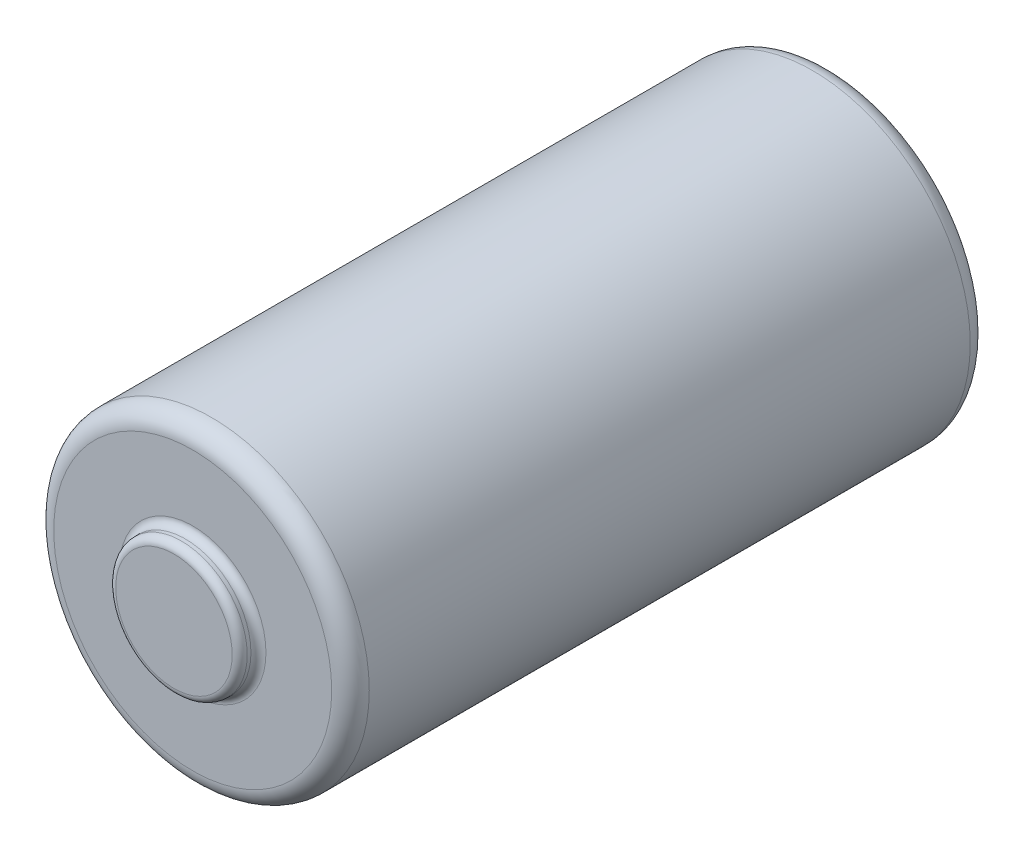
ISO-10303-21;
HEADER;
FILE_DESCRIPTION(('STEP AP214'),'2;1');
FILE_NAME('part.step','',(''),(''),'','','');
FILE_SCHEMA(('AUTOMOTIVE_DESIGN { 1 0 10303 214 1 1 1 1 }'));
ENDSEC;
DATA;
#1=APPLICATION_CONTEXT('core data for automotive mechanical design processes');
#2=APPLICATION_PROTOCOL_DEFINITION('international standard','automotive_design',2000,#1);
#3=PRODUCT_CONTEXT('',#1,'mechanical');
#4=PRODUCT('Part','Part','',(#3));
#5=PRODUCT_RELATED_PRODUCT_CATEGORY('part','',(#4));
#6=PRODUCT_DEFINITION_FORMATION('','',#4);
#7=PRODUCT_DEFINITION_CONTEXT('part definition',#1,'design');
#8=PRODUCT_DEFINITION('design','',#6,#7);
#9=PRODUCT_DEFINITION_SHAPE('','',#8);
#10=(LENGTH_UNIT() NAMED_UNIT(*) SI_UNIT(.MILLI.,.METRE.));
#11=(NAMED_UNIT(*) PLANE_ANGLE_UNIT() SI_UNIT($,.RADIAN.));
#12=(NAMED_UNIT(*) SI_UNIT($,.STERADIAN.) SOLID_ANGLE_UNIT());
#13=UNCERTAINTY_MEASURE_WITH_UNIT(LENGTH_MEASURE(1.E-05),#10,'distance_accuracy_value','');
#14=(GEOMETRIC_REPRESENTATION_CONTEXT(3) GLOBAL_UNCERTAINTY_ASSIGNED_CONTEXT((#13)) GLOBAL_UNIT_ASSIGNED_CONTEXT((#10,
#11,#12)) REPRESENTATION_CONTEXT('',''));
#15=CARTESIAN_POINT('',(0.,0.,0.));
#16=DIRECTION('',(0.,0.,1.));
#17=DIRECTION('',(1.,0.,0.));
#18=AXIS2_PLACEMENT_3D('',#15,#16,#17);
#19=CARTESIAN_POINT('',(0.,0.,34.));
#20=DIRECTION('',(0.,0.,1.));
#21=DIRECTION('',(1.,0.,0.));
#22=AXIS2_PLACEMENT_3D('',#19,#20,#21);
#23=PLANE('',#22);
#24=CARTESIAN_POINT('',(0.,0.,34.));
#25=DIRECTION('',(0.,0.,1.));
#26=DIRECTION('',(1.,0.,0.));
#27=AXIS2_PLACEMENT_3D('',#24,#25,#26);
#28=CIRCLE('',#27,3.9);
#29=CARTESIAN_POINT('',(3.9,0.,34.));
#30=VERTEX_POINT('',#29);
#31=EDGE_CURVE('E10',#30,#30,#28,.F.);
#32=ORIENTED_EDGE('',*,*,#31,.T.);
#33=EDGE_LOOP('',(#32));
#34=FACE_BOUND('',#33,.T.);
#35=CARTESIAN_POINT('',(0.,0.,34.));
#36=DIRECTION('',(0.,0.,1.));
#37=DIRECTION('',(1.,0.,0.));
#38=AXIS2_PLACEMENT_3D('',#35,#36,#37);
#39=CIRCLE('',#38,7.4);
#40=CARTESIAN_POINT('',(7.4,0.,34.));
#41=VERTEX_POINT('',#40);
#42=EDGE_CURVE('E53',#41,#41,#39,.T.);
#43=ORIENTED_EDGE('',*,*,#42,.T.);
#44=EDGE_LOOP('',(#43));
#45=FACE_BOUND('',#44,.T.);
#46=ADVANCED_FACE('F33',(#34,#45),#23,.T.);
#47=CARTESIAN_POINT('',(0.,0.,34.));
#48=DIRECTION('',(0.,0.,-1.));
#49=DIRECTION('',(-1.,0.,0.));
#50=AXIS2_PLACEMENT_3D('',#47,#48,#49);
#51=CYLINDRICAL_SURFACE('',#50,8.4);
#52=CARTESIAN_POINT('',(0.,0.,1.));
#53=DIRECTION('',(0.,0.,1.));
#54=DIRECTION('',(1.,0.,0.));
#55=AXIS2_PLACEMENT_3D('',#52,#53,#54);
#56=CIRCLE('',#55,8.4);
#57=CARTESIAN_POINT('',(8.4,0.,1.));
#58=VERTEX_POINT('',#57);
#59=EDGE_CURVE('E59',#58,#58,#56,.T.);
#60=ORIENTED_EDGE('',*,*,#59,.T.);
#61=EDGE_LOOP('',(#60));
#62=FACE_BOUND('',#61,.T.);
#63=CARTESIAN_POINT('',(0.,0.,33.));
#64=DIRECTION('',(0.,0.,1.));
#65=DIRECTION('',(1.,0.,0.));
#66=AXIS2_PLACEMENT_3D('',#63,#64,#65);
#67=CIRCLE('',#66,8.4);
#68=CARTESIAN_POINT('',(8.4,0.,33.));
#69=VERTEX_POINT('',#68);
#70=EDGE_CURVE('E62',#69,#69,#67,.F.);
#71=ORIENTED_EDGE('',*,*,#70,.T.);
#72=EDGE_LOOP('',(#71));
#73=FACE_BOUND('',#72,.T.);
#74=ADVANCED_FACE('F66',(#62,#73),#51,.T.);
#75=CARTESIAN_POINT('',(0.,0.,0.));
#76=DIRECTION('',(0.,0.,1.));
#77=DIRECTION('',(1.,0.,0.));
#78=AXIS2_PLACEMENT_3D('',#75,#76,#77);
#79=PLANE('',#78);
#80=CARTESIAN_POINT('',(0.,0.,0.));
#81=DIRECTION('',(0.,0.,1.));
#82=DIRECTION('',(1.,0.,0.));
#83=AXIS2_PLACEMENT_3D('',#80,#81,#82);
#84=CIRCLE('',#83,7.4);
#85=CARTESIAN_POINT('',(7.4,0.,0.));
#86=VERTEX_POINT('',#85);
#87=EDGE_CURVE('E56',#86,#86,#84,.F.);
#88=ORIENTED_EDGE('',*,*,#87,.T.);
#89=EDGE_LOOP('',(#88));
#90=FACE_BOUND('',#89,.T.);
#91=ADVANCED_FACE('F81',(#90),#79,.F.);
#92=CARTESIAN_POINT('',(0.,0.,35.));
#93=DIRECTION('',(0.,0.,-1.));
#94=DIRECTION('',(-1.,0.,0.));
#95=AXIS2_PLACEMENT_3D('',#92,#93,#94);
#96=CYLINDRICAL_SURFACE('',#95,3.5);
#97=CARTESIAN_POINT('',(0.,0.,34.6));
#98=DIRECTION('',(0.,0.,1.));
#99=DIRECTION('',(1.,0.,0.));
#100=AXIS2_PLACEMENT_3D('',#97,#98,#99);
#101=CIRCLE('',#100,3.5);
#102=CARTESIAN_POINT('',(3.5,0.,34.6));
#103=VERTEX_POINT('',#102);
#104=EDGE_CURVE('E40',#103,#103,#101,.F.);
#105=ORIENTED_EDGE('',*,*,#104,.T.);
#106=EDGE_LOOP('',(#105));
#107=FACE_BOUND('',#106,.T.);
#108=CARTESIAN_POINT('',(0.,0.,34.4));
#109=DIRECTION('',(0.,0.,1.));
#110=DIRECTION('',(1.,0.,0.));
#111=AXIS2_PLACEMENT_3D('',#108,#109,#110);
#112=CIRCLE('',#111,3.5);
#113=CARTESIAN_POINT('',(3.5,0.,34.4));
#114=VERTEX_POINT('',#113);
#115=EDGE_CURVE('E44',#114,#114,#112,.T.);
#116=ORIENTED_EDGE('',*,*,#115,.T.);
#117=EDGE_LOOP('',(#116));
#118=FACE_BOUND('',#117,.T.);
#119=ADVANCED_FACE('F86',(#107,#118),#96,.T.);
#120=CARTESIAN_POINT('',(0.,0.,35.));
#121=DIRECTION('',(0.,0.,1.));
#122=DIRECTION('',(1.,0.,0.));
#123=AXIS2_PLACEMENT_3D('',#120,#121,#122);
#124=PLANE('',#123);
#125=CARTESIAN_POINT('',(0.,0.,35.));
#126=DIRECTION('',(0.,0.,1.));
#127=DIRECTION('',(1.,0.,0.));
#128=AXIS2_PLACEMENT_3D('',#125,#126,#127);
#129=CIRCLE('',#128,3.1);
#130=CARTESIAN_POINT('',(3.1,0.,35.));
#131=VERTEX_POINT('',#130);
#132=EDGE_CURVE('E48',#131,#131,#129,.T.);
#133=ORIENTED_EDGE('',*,*,#132,.T.);
#134=EDGE_LOOP('',(#133));
#135=FACE_BOUND('',#134,.T.);
#136=ADVANCED_FACE('F92',(#135),#124,.T.);
#137=CARTESIAN_POINT('',(0.,0.,1.));
#138=DIRECTION('',(0.,0.,1.));
#139=DIRECTION('',(1.,0.,0.));
#140=AXIS2_PLACEMENT_3D('',#137,#138,#139);
#141=TOROIDAL_SURFACE('',#140,7.4,1.);
#142=ORIENTED_EDGE('',*,*,#87,.F.);
#143=EDGE_LOOP('',(#142));
#144=FACE_BOUND('',#143,.T.);
#145=ORIENTED_EDGE('',*,*,#59,.F.);
#146=EDGE_LOOP('',(#145));
#147=FACE_BOUND('',#146,.T.);
#148=ADVANCED_FACE('F72',(#144,#147),#141,.T.);
#149=CARTESIAN_POINT('',(0.,0.,33.));
#150=DIRECTION('',(0.,0.,1.));
#151=DIRECTION('',(1.,0.,0.));
#152=AXIS2_PLACEMENT_3D('',#149,#150,#151);
#153=TOROIDAL_SURFACE('',#152,7.4,1.);
#154=ORIENTED_EDGE('',*,*,#70,.F.);
#155=EDGE_LOOP('',(#154));
#156=FACE_BOUND('',#155,.T.);
#157=ORIENTED_EDGE('',*,*,#42,.F.);
#158=EDGE_LOOP('',(#157));
#159=FACE_BOUND('',#158,.T.);
#160=ADVANCED_FACE('F68',(#156,#159),#153,.T.);
#161=CARTESIAN_POINT('',(0.,0.,34.6));
#162=DIRECTION('',(0.,0.,1.));
#163=DIRECTION('',(1.,0.,0.));
#164=AXIS2_PLACEMENT_3D('',#161,#162,#163);
#165=TOROIDAL_SURFACE('',#164,3.1,0.4);
#166=ORIENTED_EDGE('',*,*,#104,.F.);
#167=EDGE_LOOP('',(#166));
#168=FACE_BOUND('',#167,.T.);
#169=ORIENTED_EDGE('',*,*,#132,.F.);
#170=EDGE_LOOP('',(#169));
#171=FACE_BOUND('',#170,.T.);
#172=ADVANCED_FACE('F71',(#168,#171),#165,.T.);
#173=CARTESIAN_POINT('',(0.,0.,34.4));
#174=DIRECTION('',(0.,0.,1.));
#175=DIRECTION('',(1.,0.,0.));
#176=AXIS2_PLACEMENT_3D('',#173,#174,#175);
#177=TOROIDAL_SURFACE('',#176,3.9,0.4);
#178=ORIENTED_EDGE('',*,*,#31,.F.);
#179=EDGE_LOOP('',(#178));
#180=FACE_BOUND('',#179,.T.);
#181=ORIENTED_EDGE('',*,*,#115,.F.);
#182=EDGE_LOOP('',(#181));
#183=FACE_BOUND('',#182,.T.);
#184=ADVANCED_FACE('F35',(#180,#183),#177,.F.);
#185=CLOSED_SHELL('',(#46,#74,#91,#119,#136,#148,#160,#172,#184));
#186=MANIFOLD_SOLID_BREP('B2',#185);
#187=ADVANCED_BREP_SHAPE_REPRESENTATION('',(#18,#186),#14);
#188=SHAPE_DEFINITION_REPRESENTATION(#9,#187);
ENDSEC;
END-ISO-10303-21;
